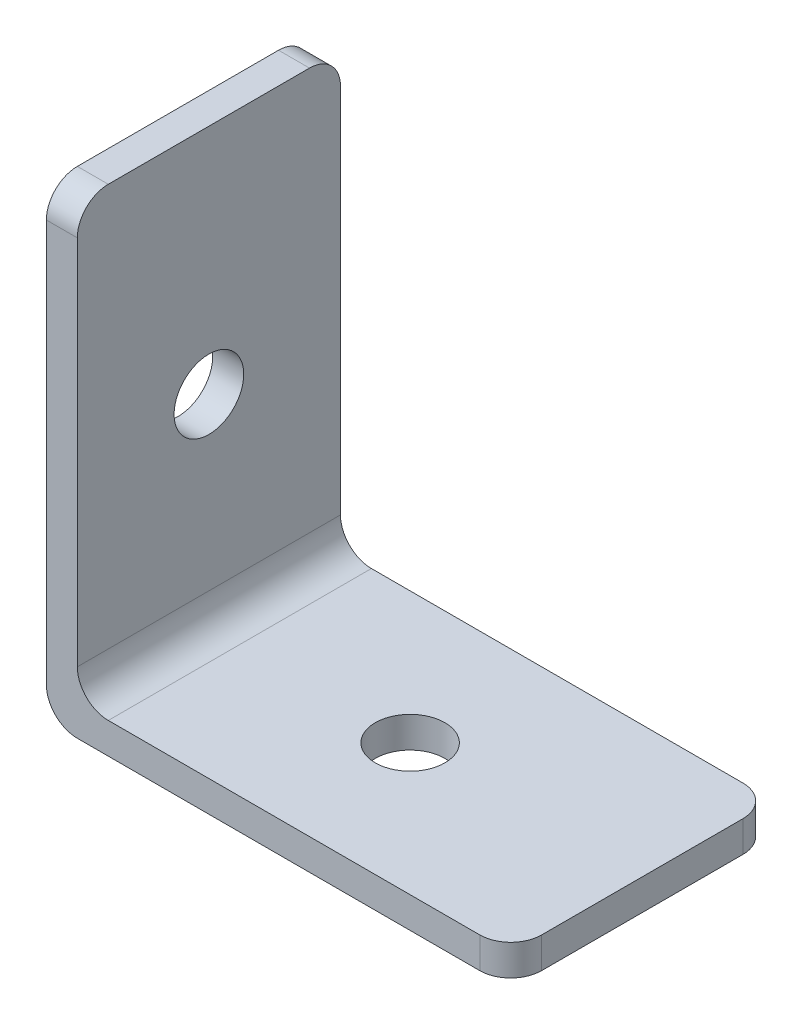
ISO-10303-21;
HEADER;
FILE_DESCRIPTION(('STEP AP214'),'2;1');
FILE_NAME('part.step','',(''),(''),'','','');
FILE_SCHEMA(('AUTOMOTIVE_DESIGN { 1 0 10303 214 1 1 1 1 }'));
ENDSEC;
DATA;
#1=APPLICATION_CONTEXT('core data for automotive mechanical design processes');
#2=APPLICATION_PROTOCOL_DEFINITION('international standard','automotive_design',2000,#1);
#3=PRODUCT_CONTEXT('',#1,'mechanical');
#4=PRODUCT('Part','Part','',(#3));
#5=PRODUCT_RELATED_PRODUCT_CATEGORY('part','',(#4));
#6=PRODUCT_DEFINITION_FORMATION('','',#4);
#7=PRODUCT_DEFINITION_CONTEXT('part definition',#1,'design');
#8=PRODUCT_DEFINITION('design','',#6,#7);
#9=PRODUCT_DEFINITION_SHAPE('','',#8);
#10=(LENGTH_UNIT() NAMED_UNIT(*) SI_UNIT(.MILLI.,.METRE.));
#11=(NAMED_UNIT(*) PLANE_ANGLE_UNIT() SI_UNIT($,.RADIAN.));
#12=(NAMED_UNIT(*) SI_UNIT($,.STERADIAN.) SOLID_ANGLE_UNIT());
#13=UNCERTAINTY_MEASURE_WITH_UNIT(LENGTH_MEASURE(1.E-05),#10,'distance_accuracy_value','');
#14=(GEOMETRIC_REPRESENTATION_CONTEXT(3) GLOBAL_UNCERTAINTY_ASSIGNED_CONTEXT((#13)) GLOBAL_UNIT_ASSIGNED_CONTEXT((#10,
#11,#12)) REPRESENTATION_CONTEXT('',''));
#15=CARTESIAN_POINT('',(0.,0.,0.));
#16=DIRECTION('',(0.,0.,1.));
#17=DIRECTION('',(1.,0.,0.));
#18=AXIS2_PLACEMENT_3D('',#15,#16,#17);
#19=CARTESIAN_POINT('',(0.,0.,17.));
#20=DIRECTION('',(0.,1.,0.));
#21=DIRECTION('',(0.,0.,1.));
#22=AXIS2_PLACEMENT_3D('',#19,#20,#21);
#23=PLANE('',#22);
#24=CARTESIAN_POINT('',(15.,0.,8.5));
#25=DIRECTION('',(0.,-1.,0.));
#26=DIRECTION('',(0.,0.,-1.));
#27=AXIS2_PLACEMENT_3D('',#24,#25,#26);
#28=CIRCLE('',#27,2.25);
#29=CARTESIAN_POINT('',(15.,0.,6.25));
#30=VERTEX_POINT('',#29);
#31=EDGE_CURVE('E394',#30,#30,#28,.T.);
#32=ORIENTED_EDGE('',*,*,#31,.F.);
#33=EDGE_LOOP('',(#32));
#34=FACE_BOUND('',#33,.T.);
#35=DIRECTION('',(1.,0.,0.));
#36=VECTOR('',#35,1.);
#37=CARTESIAN_POINT('',(0.,0.,17.));
#38=LINE('',#37,#36);
#39=CARTESIAN_POINT('',(2.,0.,17.));
#40=VERTEX_POINT('',#39);
#41=CARTESIAN_POINT('',(28.,0.,17.));
#42=VERTEX_POINT('',#41);
#43=EDGE_CURVE('E215',#40,#42,#38,.T.);
#44=ORIENTED_EDGE('',*,*,#43,.F.);
#45=DIRECTION('',(0.,0.,-1.));
#46=VECTOR('',#45,1.);
#47=CARTESIAN_POINT('',(2.,0.,17.));
#48=LINE('',#47,#46);
#49=CARTESIAN_POINT('',(2.,0.,0.));
#50=VERTEX_POINT('',#49);
#51=EDGE_CURVE('E180',#40,#50,#48,.T.);
#52=ORIENTED_EDGE('',*,*,#51,.T.);
#53=DIRECTION('',(1.,0.,0.));
#54=VECTOR('',#53,1.);
#55=CARTESIAN_POINT('',(0.,0.,0.));
#56=LINE('',#55,#54);
#57=CARTESIAN_POINT('',(28.,0.,0.));
#58=VERTEX_POINT('',#57);
#59=EDGE_CURVE('E203',#50,#58,#56,.T.);
#60=ORIENTED_EDGE('',*,*,#59,.T.);
#61=CARTESIAN_POINT('',(28.,0.,2.));
#62=DIRECTION('',(0.,1.,0.));
#63=DIRECTION('',(0.,0.,1.));
#64=AXIS2_PLACEMENT_3D('',#61,#62,#63);
#65=CIRCLE('',#64,2.);
#66=CARTESIAN_POINT('',(30.,0.,2.));
#67=VERTEX_POINT('',#66);
#68=EDGE_CURVE('E150',#58,#67,#65,.F.);
#69=ORIENTED_EDGE('',*,*,#68,.T.);
#70=DIRECTION('',(0.,0.,-1.));
#71=VECTOR('',#70,1.);
#72=CARTESIAN_POINT('',(30.,0.,17.));
#73=LINE('',#72,#71);
#74=CARTESIAN_POINT('',(30.,0.,15.));
#75=VERTEX_POINT('',#74);
#76=EDGE_CURVE('E144',#75,#67,#73,.T.);
#77=ORIENTED_EDGE('',*,*,#76,.F.);
#78=CARTESIAN_POINT('',(28.,0.,15.));
#79=DIRECTION('',(0.,1.,0.));
#80=DIRECTION('',(0.,0.,1.));
#81=AXIS2_PLACEMENT_3D('',#78,#79,#80);
#82=CIRCLE('',#81,2.);
#83=EDGE_CURVE('E149',#75,#42,#82,.F.);
#84=ORIENTED_EDGE('',*,*,#83,.T.);
#85=EDGE_LOOP('',(#44,#52,#60,#69,#77,#84));
#86=FACE_BOUND('',#85,.T.);
#87=ADVANCED_FACE('F33',(#34,#86),#23,.F.);
#88=CARTESIAN_POINT('',(30.,2.,17.));
#89=DIRECTION('',(1.,0.,0.));
#90=DIRECTION('',(0.,0.,-1.));
#91=AXIS2_PLACEMENT_3D('',#88,#89,#90);
#92=PLANE('',#91);
#93=DIRECTION('',(0.,0.,-1.));
#94=VECTOR('',#93,1.);
#95=CARTESIAN_POINT('',(30.,2.,17.));
#96=LINE('',#95,#94);
#97=CARTESIAN_POINT('',(30.,2.,15.));
#98=VERTEX_POINT('',#97);
#99=CARTESIAN_POINT('',(30.,2.,2.));
#100=VERTEX_POINT('',#99);
#101=EDGE_CURVE('E126',#98,#100,#96,.T.);
#102=ORIENTED_EDGE('',*,*,#101,.F.);
#103=DIRECTION('',(0.,-1.,0.));
#104=VECTOR('',#103,1.);
#105=CARTESIAN_POINT('',(30.,0.,15.));
#106=LINE('',#105,#104);
#107=EDGE_CURVE('E140',#98,#75,#106,.T.);
#108=ORIENTED_EDGE('',*,*,#107,.T.);
#109=ORIENTED_EDGE('',*,*,#76,.T.);
#110=DIRECTION('',(0.,-1.,0.));
#111=VECTOR('',#110,1.);
#112=CARTESIAN_POINT('',(30.,2.,2.));
#113=LINE('',#112,#111);
#114=EDGE_CURVE('E143',#67,#100,#113,.F.);
#115=ORIENTED_EDGE('',*,*,#114,.T.);
#116=EDGE_LOOP('',(#102,#108,#109,#115));
#117=FACE_BOUND('',#116,.T.);
#118=ADVANCED_FACE('F138',(#117),#92,.T.);
#119=CARTESIAN_POINT('',(0.,2.,17.));
#120=DIRECTION('',(0.,1.,0.));
#121=DIRECTION('',(0.,0.,1.));
#122=AXIS2_PLACEMENT_3D('',#119,#120,#121);
#123=PLANE('',#122);
#124=CARTESIAN_POINT('',(15.,2.,8.5));
#125=DIRECTION('',(0.,1.,0.));
#126=DIRECTION('',(0.,0.,1.));
#127=AXIS2_PLACEMENT_3D('',#124,#125,#126);
#128=CIRCLE('',#127,2.25);
#129=CARTESIAN_POINT('',(15.,2.,10.75));
#130=VERTEX_POINT('',#129);
#131=EDGE_CURVE('E37',#130,#130,#128,.T.);
#132=ORIENTED_EDGE('',*,*,#131,.F.);
#133=EDGE_LOOP('',(#132));
#134=FACE_BOUND('',#133,.T.);
#135=DIRECTION('',(1.,0.,0.));
#136=VECTOR('',#135,1.);
#137=CARTESIAN_POINT('',(0.,2.,0.));
#138=LINE('',#137,#136);
#139=CARTESIAN_POINT('',(4.,2.,0.));
#140=VERTEX_POINT('',#139);
#141=CARTESIAN_POINT('',(28.,2.,0.));
#142=VERTEX_POINT('',#141);
#143=EDGE_CURVE('E197',#140,#142,#138,.T.);
#144=ORIENTED_EDGE('',*,*,#143,.F.);
#145=DIRECTION('',(0.,0.,-1.));
#146=VECTOR('',#145,1.);
#147=CARTESIAN_POINT('',(4.,2.,17.));
#148=LINE('',#147,#146);
#149=CARTESIAN_POINT('',(4.,2.,17.));
#150=VERTEX_POINT('',#149);
#151=EDGE_CURVE('E55',#140,#150,#148,.F.);
#152=ORIENTED_EDGE('',*,*,#151,.T.);
#153=DIRECTION('',(1.,0.,0.));
#154=VECTOR('',#153,1.);
#155=CARTESIAN_POINT('',(0.,2.,17.));
#156=LINE('',#155,#154);
#157=CARTESIAN_POINT('',(28.,2.,17.));
#158=VERTEX_POINT('',#157);
#159=EDGE_CURVE('E128',#150,#158,#156,.T.);
#160=ORIENTED_EDGE('',*,*,#159,.T.);
#161=CARTESIAN_POINT('',(28.,2.,15.));
#162=DIRECTION('',(0.,1.,0.));
#163=DIRECTION('',(0.,0.,1.));
#164=AXIS2_PLACEMENT_3D('',#161,#162,#163);
#165=CIRCLE('',#164,2.);
#166=EDGE_CURVE('E122',#158,#98,#165,.T.);
#167=ORIENTED_EDGE('',*,*,#166,.T.);
#168=ORIENTED_EDGE('',*,*,#101,.T.);
#169=CARTESIAN_POINT('',(28.,2.,2.));
#170=DIRECTION('',(0.,1.,0.));
#171=DIRECTION('',(0.,0.,1.));
#172=AXIS2_PLACEMENT_3D('',#169,#170,#171);
#173=CIRCLE('',#172,2.);
#174=EDGE_CURVE('E134',#100,#142,#173,.T.);
#175=ORIENTED_EDGE('',*,*,#174,.T.);
#176=EDGE_LOOP('',(#144,#152,#160,#167,#168,#175));
#177=FACE_BOUND('',#176,.T.);
#178=ADVANCED_FACE('F124',(#134,#177),#123,.T.);
#179=CARTESIAN_POINT('',(2.,30.,17.));
#180=DIRECTION('',(1.,0.,0.));
#181=DIRECTION('',(0.,0.,-1.));
#182=AXIS2_PLACEMENT_3D('',#179,#180,#181);
#183=PLANE('',#182);
#184=CARTESIAN_POINT('',(2.,15.,8.5));
#185=DIRECTION('',(1.,0.,0.));
#186=DIRECTION('',(0.,0.,-1.));
#187=AXIS2_PLACEMENT_3D('',#184,#185,#186);
#188=CIRCLE('',#187,2.25);
#189=CARTESIAN_POINT('',(2.,15.,6.25));
#190=VERTEX_POINT('',#189);
#191=EDGE_CURVE('E219',#190,#190,#188,.T.);
#192=ORIENTED_EDGE('',*,*,#191,.F.);
#193=EDGE_LOOP('',(#192));
#194=FACE_BOUND('',#193,.T.);
#195=DIRECTION('',(0.,1.,0.));
#196=VECTOR('',#195,1.);
#197=CARTESIAN_POINT('',(2.,30.,17.));
#198=LINE('',#197,#196);
#199=CARTESIAN_POINT('',(2.,28.,17.));
#200=VERTEX_POINT('',#199);
#201=CARTESIAN_POINT('',(2.,4.,17.));
#202=VERTEX_POINT('',#201);
#203=EDGE_CURVE('E207',#200,#202,#198,.F.);
#204=ORIENTED_EDGE('',*,*,#203,.T.);
#205=DIRECTION('',(0.,0.,-1.));
#206=VECTOR('',#205,1.);
#207=CARTESIAN_POINT('',(2.,4.,0.));
#208=LINE('',#207,#206);
#209=CARTESIAN_POINT('',(2.,4.,0.));
#210=VERTEX_POINT('',#209);
#211=EDGE_CURVE('E189',#202,#210,#208,.T.);
#212=ORIENTED_EDGE('',*,*,#211,.T.);
#213=DIRECTION('',(0.,1.,0.));
#214=VECTOR('',#213,1.);
#215=CARTESIAN_POINT('',(2.,30.,0.));
#216=LINE('',#215,#214);
#217=CARTESIAN_POINT('',(2.,28.,0.));
#218=VERTEX_POINT('',#217);
#219=EDGE_CURVE('E199',#218,#210,#216,.F.);
#220=ORIENTED_EDGE('',*,*,#219,.F.);
#221=CARTESIAN_POINT('',(2.,28.,2.));
#222=DIRECTION('',(1.,0.,0.));
#223=DIRECTION('',(0.,0.,-1.));
#224=AXIS2_PLACEMENT_3D('',#221,#222,#223);
#225=CIRCLE('',#224,2.);
#226=CARTESIAN_POINT('',(2.,30.,2.));
#227=VERTEX_POINT('',#226);
#228=EDGE_CURVE('E172',#218,#227,#225,.T.);
#229=ORIENTED_EDGE('',*,*,#228,.T.);
#230=DIRECTION('',(0.,0.,-1.));
#231=VECTOR('',#230,1.);
#232=CARTESIAN_POINT('',(2.,30.,17.));
#233=LINE('',#232,#231);
#234=CARTESIAN_POINT('',(2.,30.,15.));
#235=VERTEX_POINT('',#234);
#236=EDGE_CURVE('E145',#235,#227,#233,.T.);
#237=ORIENTED_EDGE('',*,*,#236,.F.);
#238=CARTESIAN_POINT('',(2.,28.,15.));
#239=DIRECTION('',(1.,0.,0.));
#240=DIRECTION('',(0.,0.,-1.));
#241=AXIS2_PLACEMENT_3D('',#238,#239,#240);
#242=CIRCLE('',#241,2.);
#243=EDGE_CURVE('E174',#235,#200,#242,.T.);
#244=ORIENTED_EDGE('',*,*,#243,.T.);
#245=EDGE_LOOP('',(#204,#212,#220,#229,#237,#244));
#246=FACE_BOUND('',#245,.T.);
#247=ADVANCED_FACE('F206',(#194,#246),#183,.T.);
#248=CARTESIAN_POINT('',(0.,30.,17.));
#249=DIRECTION('',(0.,1.,0.));
#250=DIRECTION('',(0.,0.,1.));
#251=AXIS2_PLACEMENT_3D('',#248,#249,#250);
#252=PLANE('',#251);
#253=DIRECTION('',(0.,0.,-1.));
#254=VECTOR('',#253,1.);
#255=CARTESIAN_POINT('',(0.,30.,17.));
#256=LINE('',#255,#254);
#257=CARTESIAN_POINT('',(0.,30.,15.));
#258=VERTEX_POINT('',#257);
#259=CARTESIAN_POINT('',(0.,30.,2.));
#260=VERTEX_POINT('',#259);
#261=EDGE_CURVE('E213',#258,#260,#256,.T.);
#262=ORIENTED_EDGE('',*,*,#261,.F.);
#263=DIRECTION('',(1.,0.,0.));
#264=VECTOR('',#263,1.);
#265=CARTESIAN_POINT('',(2.,30.,15.));
#266=LINE('',#265,#264);
#267=EDGE_CURVE('E169',#258,#235,#266,.T.);
#268=ORIENTED_EDGE('',*,*,#267,.T.);
#269=ORIENTED_EDGE('',*,*,#236,.T.);
#270=DIRECTION('',(1.,0.,0.));
#271=VECTOR('',#270,1.);
#272=CARTESIAN_POINT('',(0.,30.,2.));
#273=LINE('',#272,#271);
#274=EDGE_CURVE('E167',#227,#260,#273,.F.);
#275=ORIENTED_EDGE('',*,*,#274,.T.);
#276=EDGE_LOOP('',(#262,#268,#269,#275));
#277=FACE_BOUND('',#276,.T.);
#278=ADVANCED_FACE('F250',(#277),#252,.T.);
#279=CARTESIAN_POINT('',(0.,30.,17.));
#280=DIRECTION('',(1.,0.,0.));
#281=DIRECTION('',(0.,0.,-1.));
#282=AXIS2_PLACEMENT_3D('',#279,#280,#281);
#283=PLANE('',#282);
#284=CARTESIAN_POINT('',(0.,15.,8.5));
#285=DIRECTION('',(-1.,0.,0.));
#286=DIRECTION('',(0.,0.,1.));
#287=AXIS2_PLACEMENT_3D('',#284,#285,#286);
#288=CIRCLE('',#287,2.25);
#289=CARTESIAN_POINT('',(0.,15.,10.75));
#290=VERTEX_POINT('',#289);
#291=EDGE_CURVE('E396',#290,#290,#288,.T.);
#292=ORIENTED_EDGE('',*,*,#291,.F.);
#293=EDGE_LOOP('',(#292));
#294=FACE_BOUND('',#293,.T.);
#295=DIRECTION('',(0.,-1.,0.));
#296=VECTOR('',#295,1.);
#297=CARTESIAN_POINT('',(0.,30.,0.));
#298=LINE('',#297,#296);
#299=CARTESIAN_POINT('',(0.,28.,0.));
#300=VERTEX_POINT('',#299);
#301=CARTESIAN_POINT('',(0.,2.,0.));
#302=VERTEX_POINT('',#301);
#303=EDGE_CURVE('E222',#300,#302,#298,.T.);
#304=ORIENTED_EDGE('',*,*,#303,.T.);
#305=DIRECTION('',(0.,0.,-1.));
#306=VECTOR('',#305,1.);
#307=CARTESIAN_POINT('',(0.,2.,17.));
#308=LINE('',#307,#306);
#309=CARTESIAN_POINT('',(0.,2.,17.));
#310=VERTEX_POINT('',#309);
#311=EDGE_CURVE('E185',#302,#310,#308,.F.);
#312=ORIENTED_EDGE('',*,*,#311,.T.);
#313=DIRECTION('',(0.,-1.,0.));
#314=VECTOR('',#313,1.);
#315=CARTESIAN_POINT('',(0.,30.,17.));
#316=LINE('',#315,#314);
#317=CARTESIAN_POINT('',(0.,28.,17.));
#318=VERTEX_POINT('',#317);
#319=EDGE_CURVE('E210',#318,#310,#316,.T.);
#320=ORIENTED_EDGE('',*,*,#319,.F.);
#321=CARTESIAN_POINT('',(0.,28.,15.));
#322=DIRECTION('',(1.,0.,0.));
#323=DIRECTION('',(0.,0.,-1.));
#324=AXIS2_PLACEMENT_3D('',#321,#322,#323);
#325=CIRCLE('',#324,2.);
#326=EDGE_CURVE('E178',#318,#258,#325,.F.);
#327=ORIENTED_EDGE('',*,*,#326,.T.);
#328=ORIENTED_EDGE('',*,*,#261,.T.);
#329=CARTESIAN_POINT('',(0.,28.,2.));
#330=DIRECTION('',(1.,0.,0.));
#331=DIRECTION('',(0.,0.,-1.));
#332=AXIS2_PLACEMENT_3D('',#329,#330,#331);
#333=CIRCLE('',#332,2.);
#334=EDGE_CURVE('E176',#260,#300,#333,.F.);
#335=ORIENTED_EDGE('',*,*,#334,.T.);
#336=EDGE_LOOP('',(#304,#312,#320,#327,#328,#335));
#337=FACE_BOUND('',#336,.T.);
#338=ADVANCED_FACE('F241',(#294,#337),#283,.F.);
#339=CARTESIAN_POINT('',(0.,0.,17.));
#340=DIRECTION('',(0.,0.,-1.));
#341=DIRECTION('',(-1.,0.,0.));
#342=AXIS2_PLACEMENT_3D('',#339,#340,#341);
#343=PLANE('',#342);
#344=ORIENTED_EDGE('',*,*,#319,.T.);
#345=CARTESIAN_POINT('',(2.,2.,17.));
#346=DIRECTION('',(0.,0.,-1.));
#347=DIRECTION('',(-1.,0.,0.));
#348=AXIS2_PLACEMENT_3D('',#345,#346,#347);
#349=CIRCLE('',#348,2.);
#350=EDGE_CURVE('E187',#310,#40,#349,.F.);
#351=ORIENTED_EDGE('',*,*,#350,.T.);
#352=ORIENTED_EDGE('',*,*,#43,.T.);
#353=DIRECTION('',(0.,-1.,0.));
#354=VECTOR('',#353,1.);
#355=CARTESIAN_POINT('',(28.,2.,17.));
#356=LINE('',#355,#354);
#357=EDGE_CURVE('E159',#42,#158,#356,.F.);
#358=ORIENTED_EDGE('',*,*,#357,.T.);
#359=ORIENTED_EDGE('',*,*,#159,.F.);
#360=CARTESIAN_POINT('',(4.,4.,17.));
#361=DIRECTION('',(0.,0.,-1.));
#362=DIRECTION('',(-1.,0.,0.));
#363=AXIS2_PLACEMENT_3D('',#360,#361,#362);
#364=CIRCLE('',#363,2.);
#365=EDGE_CURVE('E11',#150,#202,#364,.T.);
#366=ORIENTED_EDGE('',*,*,#365,.T.);
#367=ORIENTED_EDGE('',*,*,#203,.F.);
#368=DIRECTION('',(1.,0.,0.));
#369=VECTOR('',#368,1.);
#370=CARTESIAN_POINT('',(0.,28.,17.));
#371=LINE('',#370,#369);
#372=EDGE_CURVE('E157',#200,#318,#371,.F.);
#373=ORIENTED_EDGE('',*,*,#372,.T.);
#374=EDGE_LOOP('',(#344,#351,#352,#358,#359,#366,#367,#373));
#375=FACE_BOUND('',#374,.T.);
#376=ADVANCED_FACE('F243',(#375),#343,.F.);
#377=CARTESIAN_POINT('',(0.,0.,0.));
#378=DIRECTION('',(0.,0.,-1.));
#379=DIRECTION('',(-1.,0.,0.));
#380=AXIS2_PLACEMENT_3D('',#377,#378,#379);
#381=PLANE('',#380);
#382=ORIENTED_EDGE('',*,*,#59,.F.);
#383=CARTESIAN_POINT('',(2.,2.,0.));
#384=DIRECTION('',(0.,0.,-1.));
#385=DIRECTION('',(-1.,0.,0.));
#386=AXIS2_PLACEMENT_3D('',#383,#384,#385);
#387=CIRCLE('',#386,2.);
#388=EDGE_CURVE('E183',#50,#302,#387,.T.);
#389=ORIENTED_EDGE('',*,*,#388,.T.);
#390=ORIENTED_EDGE('',*,*,#303,.F.);
#391=DIRECTION('',(1.,0.,0.));
#392=VECTOR('',#391,1.);
#393=CARTESIAN_POINT('',(0.,28.,0.));
#394=LINE('',#393,#392);
#395=EDGE_CURVE('E133',#300,#218,#394,.T.);
#396=ORIENTED_EDGE('',*,*,#395,.T.);
#397=ORIENTED_EDGE('',*,*,#219,.T.);
#398=CARTESIAN_POINT('',(4.,4.,0.));
#399=DIRECTION('',(0.,0.,-1.));
#400=DIRECTION('',(-1.,0.,0.));
#401=AXIS2_PLACEMENT_3D('',#398,#399,#400);
#402=CIRCLE('',#401,2.);
#403=EDGE_CURVE('E42',#210,#140,#402,.F.);
#404=ORIENTED_EDGE('',*,*,#403,.T.);
#405=ORIENTED_EDGE('',*,*,#143,.T.);
#406=DIRECTION('',(0.,-1.,0.));
#407=VECTOR('',#406,1.);
#408=CARTESIAN_POINT('',(28.,0.,0.));
#409=LINE('',#408,#407);
#410=EDGE_CURVE('E164',#142,#58,#409,.T.);
#411=ORIENTED_EDGE('',*,*,#410,.T.);
#412=EDGE_LOOP('',(#382,#389,#390,#396,#397,#404,#405,#411));
#413=FACE_BOUND('',#412,.T.);
#414=ADVANCED_FACE('F196',(#413),#381,.T.);
#415=CARTESIAN_POINT('',(28.,2.,15.));
#416=DIRECTION('',(0.,1.,0.));
#417=DIRECTION('',(0.,0.,1.));
#418=AXIS2_PLACEMENT_3D('',#415,#416,#417);
#419=CYLINDRICAL_SURFACE('',#418,2.);
#420=ORIENTED_EDGE('',*,*,#166,.F.);
#421=ORIENTED_EDGE('',*,*,#357,.F.);
#422=ORIENTED_EDGE('',*,*,#83,.F.);
#423=ORIENTED_EDGE('',*,*,#107,.F.);
#424=EDGE_LOOP('',(#420,#421,#422,#423));
#425=FACE_BOUND('',#424,.T.);
#426=ADVANCED_FACE('F147',(#425),#419,.T.);
#427=CARTESIAN_POINT('',(28.,0.,2.));
#428=DIRECTION('',(0.,-1.,0.));
#429=DIRECTION('',(0.,0.,-1.));
#430=AXIS2_PLACEMENT_3D('',#427,#428,#429);
#431=CYLINDRICAL_SURFACE('',#430,2.);
#432=ORIENTED_EDGE('',*,*,#174,.F.);
#433=ORIENTED_EDGE('',*,*,#114,.F.);
#434=ORIENTED_EDGE('',*,*,#68,.F.);
#435=ORIENTED_EDGE('',*,*,#410,.F.);
#436=EDGE_LOOP('',(#432,#433,#434,#435));
#437=FACE_BOUND('',#436,.T.);
#438=ADVANCED_FACE('F231',(#437),#431,.T.);
#439=CARTESIAN_POINT('',(0.,28.,15.));
#440=DIRECTION('',(-1.,0.,0.));
#441=DIRECTION('',(0.,0.,1.));
#442=AXIS2_PLACEMENT_3D('',#439,#440,#441);
#443=CYLINDRICAL_SURFACE('',#442,2.);
#444=ORIENTED_EDGE('',*,*,#326,.F.);
#445=ORIENTED_EDGE('',*,*,#372,.F.);
#446=ORIENTED_EDGE('',*,*,#243,.F.);
#447=ORIENTED_EDGE('',*,*,#267,.F.);
#448=EDGE_LOOP('',(#444,#445,#446,#447));
#449=FACE_BOUND('',#448,.T.);
#450=ADVANCED_FACE('F245',(#449),#443,.T.);
#451=CARTESIAN_POINT('',(0.,28.,2.));
#452=DIRECTION('',(1.,0.,0.));
#453=DIRECTION('',(0.,0.,-1.));
#454=AXIS2_PLACEMENT_3D('',#451,#452,#453);
#455=CYLINDRICAL_SURFACE('',#454,2.);
#456=ORIENTED_EDGE('',*,*,#334,.F.);
#457=ORIENTED_EDGE('',*,*,#274,.F.);
#458=ORIENTED_EDGE('',*,*,#228,.F.);
#459=ORIENTED_EDGE('',*,*,#395,.F.);
#460=EDGE_LOOP('',(#456,#457,#458,#459));
#461=FACE_BOUND('',#460,.T.);
#462=ADVANCED_FACE('F253',(#461),#455,.T.);
#463=CARTESIAN_POINT('',(2.,2.,17.));
#464=DIRECTION('',(0.,0.,-1.));
#465=DIRECTION('',(-1.,0.,0.));
#466=AXIS2_PLACEMENT_3D('',#463,#464,#465);
#467=CYLINDRICAL_SURFACE('',#466,2.);
#468=ORIENTED_EDGE('',*,*,#350,.F.);
#469=ORIENTED_EDGE('',*,*,#311,.F.);
#470=ORIENTED_EDGE('',*,*,#388,.F.);
#471=ORIENTED_EDGE('',*,*,#51,.F.);
#472=EDGE_LOOP('',(#468,#469,#470,#471));
#473=FACE_BOUND('',#472,.T.);
#474=ADVANCED_FACE('F237',(#473),#467,.T.);
#475=CARTESIAN_POINT('',(4.,4.,17.));
#476=DIRECTION('',(0.,0.,1.));
#477=DIRECTION('',(1.,0.,0.));
#478=AXIS2_PLACEMENT_3D('',#475,#476,#477);
#479=CYLINDRICAL_SURFACE('',#478,2.);
#480=ORIENTED_EDGE('',*,*,#365,.F.);
#481=ORIENTED_EDGE('',*,*,#151,.F.);
#482=ORIENTED_EDGE('',*,*,#403,.F.);
#483=ORIENTED_EDGE('',*,*,#211,.F.);
#484=EDGE_LOOP('',(#480,#481,#482,#483));
#485=FACE_BOUND('',#484,.T.);
#486=ADVANCED_FACE('F35',(#485),#479,.F.);
#487=CARTESIAN_POINT('',(10.,15.,8.5));
#488=DIRECTION('',(-1.,0.,0.));
#489=DIRECTION('',(0.,0.,1.));
#490=AXIS2_PLACEMENT_3D('',#487,#488,#489);
#491=CYLINDRICAL_SURFACE('',#490,2.25);
#492=ORIENTED_EDGE('',*,*,#191,.T.);
#493=EDGE_LOOP('',(#492));
#494=FACE_BOUND('',#493,.T.);
#495=ORIENTED_EDGE('',*,*,#291,.T.);
#496=EDGE_LOOP('',(#495));
#497=FACE_BOUND('',#496,.T.);
#498=ADVANCED_FACE('F321',(#494,#497),#491,.F.);
#499=CARTESIAN_POINT('',(15.,10.,8.5));
#500=DIRECTION('',(0.,-1.,0.));
#501=DIRECTION('',(0.,0.,-1.));
#502=AXIS2_PLACEMENT_3D('',#499,#500,#501);
#503=CYLINDRICAL_SURFACE('',#502,2.25);
#504=ORIENTED_EDGE('',*,*,#131,.T.);
#505=EDGE_LOOP('',(#504));
#506=FACE_BOUND('',#505,.T.);
#507=ORIENTED_EDGE('',*,*,#31,.T.);
#508=EDGE_LOOP('',(#507));
#509=FACE_BOUND('',#508,.T.);
#510=ADVANCED_FACE('F348',(#506,#509),#503,.F.);
#511=CLOSED_SHELL('',(#87,#118,#178,#247,#278,#338,#376,#414,#426,#438,#450,#462,#474,#486,#498,#510));
#512=MANIFOLD_SOLID_BREP('B2',#511);
#513=ADVANCED_BREP_SHAPE_REPRESENTATION('',(#18,#512),#14);
#514=SHAPE_DEFINITION_REPRESENTATION(#9,#513);
ENDSEC;
END-ISO-10303-21;
